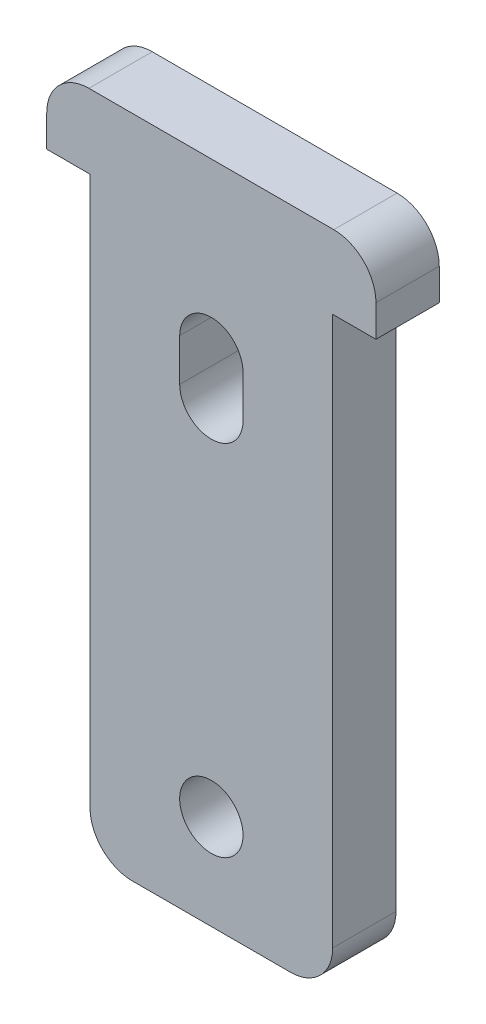
ISO-10303-21;
HEADER;
FILE_DESCRIPTION(('STEP AP214'),'2;1');
FILE_NAME('part.step','',(''),(''),'','','');
FILE_SCHEMA(('AUTOMOTIVE_DESIGN { 1 0 10303 214 1 1 1 1 }'));
ENDSEC;
DATA;
#1=APPLICATION_CONTEXT('core data for automotive mechanical design processes');
#2=APPLICATION_PROTOCOL_DEFINITION('international standard','automotive_design',2000,#1);
#3=PRODUCT_CONTEXT('',#1,'mechanical');
#4=PRODUCT('Part','Part','',(#3));
#5=PRODUCT_RELATED_PRODUCT_CATEGORY('part','',(#4));
#6=PRODUCT_DEFINITION_FORMATION('','',#4);
#7=PRODUCT_DEFINITION_CONTEXT('part definition',#1,'design');
#8=PRODUCT_DEFINITION('design','',#6,#7);
#9=PRODUCT_DEFINITION_SHAPE('','',#8);
#10=(LENGTH_UNIT() NAMED_UNIT(*) SI_UNIT(.MILLI.,.METRE.));
#11=(NAMED_UNIT(*) PLANE_ANGLE_UNIT() SI_UNIT($,.RADIAN.));
#12=(NAMED_UNIT(*) SI_UNIT($,.STERADIAN.) SOLID_ANGLE_UNIT());
#13=UNCERTAINTY_MEASURE_WITH_UNIT(LENGTH_MEASURE(1.E-05),#10,'distance_accuracy_value','');
#14=(GEOMETRIC_REPRESENTATION_CONTEXT(3) GLOBAL_UNCERTAINTY_ASSIGNED_CONTEXT((#13)) GLOBAL_UNIT_ASSIGNED_CONTEXT((#10,
#11,#12)) REPRESENTATION_CONTEXT('',''));
#15=CARTESIAN_POINT('',(0.,0.,0.));
#16=DIRECTION('',(0.,0.,1.));
#17=DIRECTION('',(1.,0.,0.));
#18=AXIS2_PLACEMENT_3D('',#15,#16,#17);
#19=CARTESIAN_POINT('',(0.,0.,3.));
#20=DIRECTION('',(0.,0.,-1.));
#21=DIRECTION('',(-1.,0.,0.));
#22=AXIS2_PLACEMENT_3D('',#19,#20,#21);
#23=PLANE('',#22);
#24=CARTESIAN_POINT('',(5.75,4.5,3.));
#25=DIRECTION('',(0.,0.,1.));
#26=DIRECTION('',(1.,0.,0.));
#27=AXIS2_PLACEMENT_3D('',#24,#25,#26);
#28=CIRCLE('',#27,1.5);
#29=CARTESIAN_POINT('',(7.25,4.5,3.));
#30=VERTEX_POINT('',#29);
#31=EDGE_CURVE('E189',#30,#30,#28,.T.);
#32=ORIENTED_EDGE('',*,*,#31,.F.);
#33=EDGE_LOOP('',(#32));
#34=FACE_BOUND('',#33,.T.);
#35=DIRECTION('',(1.,0.,0.));
#36=VECTOR('',#35,1.);
#37=CARTESIAN_POINT('',(0.,0.,3.));
#38=LINE('',#37,#36);
#39=CARTESIAN_POINT('',(2.,0.,3.));
#40=VERTEX_POINT('',#39);
#41=CARTESIAN_POINT('',(9.5,0.,3.));
#42=VERTEX_POINT('',#41);
#43=EDGE_CURVE('E197',#40,#42,#38,.T.);
#44=ORIENTED_EDGE('',*,*,#43,.T.);
#45=CARTESIAN_POINT('',(9.5,2.,3.));
#46=DIRECTION('',(0.,0.,-1.));
#47=DIRECTION('',(-1.,0.,0.));
#48=AXIS2_PLACEMENT_3D('',#45,#46,#47);
#49=CIRCLE('',#48,2.);
#50=CARTESIAN_POINT('',(11.5,2.,3.));
#51=VERTEX_POINT('',#50);
#52=EDGE_CURVE('E40',#42,#51,#49,.F.);
#53=ORIENTED_EDGE('',*,*,#52,.T.);
#54=DIRECTION('',(0.,1.,0.));
#55=VECTOR('',#54,1.);
#56=CARTESIAN_POINT('',(11.5,0.,3.));
#57=LINE('',#56,#55);
#58=CARTESIAN_POINT('',(11.5,28.,3.));
#59=VERTEX_POINT('',#58);
#60=EDGE_CURVE('E200',#51,#59,#57,.T.);
#61=ORIENTED_EDGE('',*,*,#60,.T.);
#62=DIRECTION('',(1.,0.,0.));
#63=VECTOR('',#62,1.);
#64=CARTESIAN_POINT('',(11.5,28.,3.));
#65=LINE('',#64,#63);
#66=CARTESIAN_POINT('',(13.55,28.,3.));
#67=VERTEX_POINT('',#66);
#68=EDGE_CURVE('E202',#59,#67,#65,.T.);
#69=ORIENTED_EDGE('',*,*,#68,.T.);
#70=DIRECTION('',(0.,1.,0.));
#71=VECTOR('',#70,1.);
#72=CARTESIAN_POINT('',(13.55,28.,3.));
#73=LINE('',#72,#71);
#74=CARTESIAN_POINT('',(13.55,29.5,3.));
#75=VERTEX_POINT('',#74);
#76=EDGE_CURVE('E204',#67,#75,#73,.T.);
#77=ORIENTED_EDGE('',*,*,#76,.T.);
#78=CARTESIAN_POINT('',(11.55,29.5,3.));
#79=DIRECTION('',(0.,0.,-1.));
#80=DIRECTION('',(-1.,0.,0.));
#81=AXIS2_PLACEMENT_3D('',#78,#79,#80);
#82=CIRCLE('',#81,2.);
#83=CARTESIAN_POINT('',(11.55,31.5,3.));
#84=VERTEX_POINT('',#83);
#85=EDGE_CURVE('E254',#75,#84,#82,.F.);
#86=ORIENTED_EDGE('',*,*,#85,.T.);
#87=DIRECTION('',(-1.,0.,0.));
#88=VECTOR('',#87,1.);
#89=CARTESIAN_POINT('',(-2.05,31.5,3.));
#90=LINE('',#89,#88);
#91=CARTESIAN_POINT('',(-0.0499999999999997,31.5,3.));
#92=VERTEX_POINT('',#91);
#93=EDGE_CURVE('E207',#84,#92,#90,.T.);
#94=ORIENTED_EDGE('',*,*,#93,.T.);
#95=CARTESIAN_POINT('',(-0.0499999999999997,29.5,3.));
#96=DIRECTION('',(0.,0.,-1.));
#97=DIRECTION('',(-1.,0.,0.));
#98=AXIS2_PLACEMENT_3D('',#95,#96,#97);
#99=CIRCLE('',#98,2.);
#100=CARTESIAN_POINT('',(-2.05,29.5,3.));
#101=VERTEX_POINT('',#100);
#102=EDGE_CURVE('E256',#92,#101,#99,.F.);
#103=ORIENTED_EDGE('',*,*,#102,.T.);
#104=DIRECTION('',(0.,-1.,0.));
#105=VECTOR('',#104,1.);
#106=CARTESIAN_POINT('',(-2.05,28.,3.));
#107=LINE('',#106,#105);
#108=CARTESIAN_POINT('',(-2.05,28.,3.));
#109=VERTEX_POINT('',#108);
#110=EDGE_CURVE('E210',#101,#109,#107,.T.);
#111=ORIENTED_EDGE('',*,*,#110,.T.);
#112=DIRECTION('',(1.,0.,0.));
#113=VECTOR('',#112,1.);
#114=CARTESIAN_POINT('',(-2.05,28.,3.));
#115=LINE('',#114,#113);
#116=CARTESIAN_POINT('',(0.,28.,3.));
#117=VERTEX_POINT('',#116);
#118=EDGE_CURVE('E212',#109,#117,#115,.T.);
#119=ORIENTED_EDGE('',*,*,#118,.T.);
#120=DIRECTION('',(0.,-1.,0.));
#121=VECTOR('',#120,1.);
#122=CARTESIAN_POINT('',(0.,0.,3.));
#123=LINE('',#122,#121);
#124=CARTESIAN_POINT('',(0.,2.,3.));
#125=VERTEX_POINT('',#124);
#126=EDGE_CURVE('E195',#117,#125,#123,.T.);
#127=ORIENTED_EDGE('',*,*,#126,.T.);
#128=CARTESIAN_POINT('',(2.,2.,3.));
#129=DIRECTION('',(0.,0.,-1.));
#130=DIRECTION('',(-1.,0.,0.));
#131=AXIS2_PLACEMENT_3D('',#128,#129,#130);
#132=CIRCLE('',#131,2.);
#133=EDGE_CURVE('E271',#125,#40,#132,.F.);
#134=ORIENTED_EDGE('',*,*,#133,.T.);
#135=EDGE_LOOP('',(#44,#53,#61,#69,#77,#86,#94,#103,#111,#119,#127,#134));
#136=FACE_BOUND('',#135,.T.);
#137=CARTESIAN_POINT('',(5.75,21.5,3.));
#138=DIRECTION('',(0.,0.,1.));
#139=DIRECTION('',(1.,0.,0.));
#140=AXIS2_PLACEMENT_3D('',#137,#138,#139);
#141=CIRCLE('',#140,1.5);
#142=CARTESIAN_POINT('',(4.25,21.5,3.));
#143=VERTEX_POINT('',#142);
#144=CARTESIAN_POINT('',(7.25,21.5,3.));
#145=VERTEX_POINT('',#144);
#146=EDGE_CURVE('E148',#143,#145,#141,.T.);
#147=ORIENTED_EDGE('',*,*,#146,.F.);
#148=DIRECTION('',(0.,-1.,0.));
#149=VECTOR('',#148,1.);
#150=CARTESIAN_POINT('',(4.25,21.5,3.));
#151=LINE('',#150,#149);
#152=CARTESIAN_POINT('',(4.25,23.5,3.));
#153=VERTEX_POINT('',#152);
#154=EDGE_CURVE('E173',#153,#143,#151,.T.);
#155=ORIENTED_EDGE('',*,*,#154,.F.);
#156=CARTESIAN_POINT('',(5.75,23.5,3.));
#157=DIRECTION('',(0.,0.,1.));
#158=DIRECTION('',(1.,0.,0.));
#159=AXIS2_PLACEMENT_3D('',#156,#157,#158);
#160=CIRCLE('',#159,1.5);
#161=CARTESIAN_POINT('',(7.25,23.5,3.));
#162=VERTEX_POINT('',#161);
#163=EDGE_CURVE('E171',#162,#153,#160,.T.);
#164=ORIENTED_EDGE('',*,*,#163,.F.);
#165=DIRECTION('',(0.,1.,0.));
#166=VECTOR('',#165,1.);
#167=CARTESIAN_POINT('',(7.25,23.5,3.));
#168=LINE('',#167,#166);
#169=EDGE_CURVE('E158',#145,#162,#168,.T.);
#170=ORIENTED_EDGE('',*,*,#169,.F.);
#171=EDGE_LOOP('',(#147,#155,#164,#170));
#172=FACE_BOUND('',#171,.T.);
#173=ADVANCED_FACE('F32',(#34,#136,#172),#23,.F.);
#174=CARTESIAN_POINT('',(0.,0.,0.));
#175=DIRECTION('',(0.,0.,-1.));
#176=DIRECTION('',(-1.,0.,0.));
#177=AXIS2_PLACEMENT_3D('',#174,#175,#176);
#178=PLANE('',#177);
#179=CARTESIAN_POINT('',(5.75,4.5,0.));
#180=DIRECTION('',(0.,0.,1.));
#181=DIRECTION('',(1.,0.,0.));
#182=AXIS2_PLACEMENT_3D('',#179,#180,#181);
#183=CIRCLE('',#182,1.5);
#184=CARTESIAN_POINT('',(7.25,4.5,0.));
#185=VERTEX_POINT('',#184);
#186=EDGE_CURVE('E166',#185,#185,#183,.T.);
#187=ORIENTED_EDGE('',*,*,#186,.T.);
#188=EDGE_LOOP('',(#187));
#189=FACE_BOUND('',#188,.T.);
#190=DIRECTION('',(0.,1.,0.));
#191=VECTOR('',#190,1.);
#192=CARTESIAN_POINT('',(11.5,0.,0.));
#193=LINE('',#192,#191);
#194=CARTESIAN_POINT('',(11.5,2.,0.));
#195=VERTEX_POINT('',#194);
#196=CARTESIAN_POINT('',(11.5,28.,0.));
#197=VERTEX_POINT('',#196);
#198=EDGE_CURVE('E218',#195,#197,#193,.T.);
#199=ORIENTED_EDGE('',*,*,#198,.F.);
#200=CARTESIAN_POINT('',(9.5,2.,0.));
#201=DIRECTION('',(0.,0.,-1.));
#202=DIRECTION('',(-1.,0.,0.));
#203=AXIS2_PLACEMENT_3D('',#200,#201,#202);
#204=CIRCLE('',#203,2.);
#205=CARTESIAN_POINT('',(9.5,0.,0.));
#206=VERTEX_POINT('',#205);
#207=EDGE_CURVE('E265',#195,#206,#204,.T.);
#208=ORIENTED_EDGE('',*,*,#207,.T.);
#209=DIRECTION('',(1.,0.,0.));
#210=VECTOR('',#209,1.);
#211=CARTESIAN_POINT('',(0.,0.,0.));
#212=LINE('',#211,#210);
#213=CARTESIAN_POINT('',(2.,0.,0.));
#214=VERTEX_POINT('',#213);
#215=EDGE_CURVE('E216',#214,#206,#212,.T.);
#216=ORIENTED_EDGE('',*,*,#215,.F.);
#217=CARTESIAN_POINT('',(2.,2.,0.));
#218=DIRECTION('',(0.,0.,-1.));
#219=DIRECTION('',(-1.,0.,0.));
#220=AXIS2_PLACEMENT_3D('',#217,#218,#219);
#221=CIRCLE('',#220,2.);
#222=CARTESIAN_POINT('',(0.,2.,0.));
#223=VERTEX_POINT('',#222);
#224=EDGE_CURVE('E263',#214,#223,#221,.T.);
#225=ORIENTED_EDGE('',*,*,#224,.T.);
#226=DIRECTION('',(0.,-1.,0.));
#227=VECTOR('',#226,1.);
#228=CARTESIAN_POINT('',(0.,0.,0.));
#229=LINE('',#228,#227);
#230=CARTESIAN_POINT('',(0.,28.,0.));
#231=VERTEX_POINT('',#230);
#232=EDGE_CURVE('E192',#231,#223,#229,.T.);
#233=ORIENTED_EDGE('',*,*,#232,.F.);
#234=DIRECTION('',(1.,0.,0.));
#235=VECTOR('',#234,1.);
#236=CARTESIAN_POINT('',(-2.05,28.,0.));
#237=LINE('',#236,#235);
#238=CARTESIAN_POINT('',(-2.05,28.,0.));
#239=VERTEX_POINT('',#238);
#240=EDGE_CURVE('E198',#239,#231,#237,.T.);
#241=ORIENTED_EDGE('',*,*,#240,.F.);
#242=DIRECTION('',(0.,-1.,0.));
#243=VECTOR('',#242,1.);
#244=CARTESIAN_POINT('',(-2.05,28.,0.));
#245=LINE('',#244,#243);
#246=CARTESIAN_POINT('',(-2.05,29.5,0.));
#247=VERTEX_POINT('',#246);
#248=EDGE_CURVE('E228',#247,#239,#245,.T.);
#249=ORIENTED_EDGE('',*,*,#248,.F.);
#250=CARTESIAN_POINT('',(-0.0499999999999997,29.5,0.));
#251=DIRECTION('',(0.,0.,-1.));
#252=DIRECTION('',(-1.,0.,0.));
#253=AXIS2_PLACEMENT_3D('',#250,#251,#252);
#254=CIRCLE('',#253,2.);
#255=CARTESIAN_POINT('',(-0.0499999999999997,31.5,0.));
#256=VERTEX_POINT('',#255);
#257=EDGE_CURVE('E247',#247,#256,#254,.T.);
#258=ORIENTED_EDGE('',*,*,#257,.T.);
#259=DIRECTION('',(-1.,0.,0.));
#260=VECTOR('',#259,1.);
#261=CARTESIAN_POINT('',(-2.05,31.5,0.));
#262=LINE('',#261,#260);
#263=CARTESIAN_POINT('',(11.55,31.5,0.));
#264=VERTEX_POINT('',#263);
#265=EDGE_CURVE('E225',#264,#256,#262,.T.);
#266=ORIENTED_EDGE('',*,*,#265,.F.);
#267=CARTESIAN_POINT('',(11.55,29.5,0.));
#268=DIRECTION('',(0.,0.,-1.));
#269=DIRECTION('',(-1.,0.,0.));
#270=AXIS2_PLACEMENT_3D('',#267,#268,#269);
#271=CIRCLE('',#270,2.);
#272=CARTESIAN_POINT('',(13.55,29.5,0.));
#273=VERTEX_POINT('',#272);
#274=EDGE_CURVE('E245',#264,#273,#271,.T.);
#275=ORIENTED_EDGE('',*,*,#274,.T.);
#276=DIRECTION('',(0.,1.,0.));
#277=VECTOR('',#276,1.);
#278=CARTESIAN_POINT('',(13.55,28.,0.));
#279=LINE('',#278,#277);
#280=CARTESIAN_POINT('',(13.55,28.,0.));
#281=VERTEX_POINT('',#280);
#282=EDGE_CURVE('E222',#281,#273,#279,.T.);
#283=ORIENTED_EDGE('',*,*,#282,.F.);
#284=DIRECTION('',(1.,0.,0.));
#285=VECTOR('',#284,1.);
#286=CARTESIAN_POINT('',(11.5,28.,0.));
#287=LINE('',#286,#285);
#288=EDGE_CURVE('E220',#197,#281,#287,.T.);
#289=ORIENTED_EDGE('',*,*,#288,.F.);
#290=EDGE_LOOP('',(#199,#208,#216,#225,#233,#241,#249,#258,#266,#275,#283,#289));
#291=FACE_BOUND('',#290,.T.);
#292=DIRECTION('',(0.,-1.,0.));
#293=VECTOR('',#292,1.);
#294=CARTESIAN_POINT('',(4.25,21.5,0.));
#295=LINE('',#294,#293);
#296=CARTESIAN_POINT('',(4.25,23.5,0.));
#297=VERTEX_POINT('',#296);
#298=CARTESIAN_POINT('',(4.25,21.5,0.));
#299=VERTEX_POINT('',#298);
#300=EDGE_CURVE('E159',#297,#299,#295,.T.);
#301=ORIENTED_EDGE('',*,*,#300,.T.);
#302=CARTESIAN_POINT('',(5.75,21.5,0.));
#303=DIRECTION('',(0.,0.,1.));
#304=DIRECTION('',(1.,0.,0.));
#305=AXIS2_PLACEMENT_3D('',#302,#303,#304);
#306=CIRCLE('',#305,1.5);
#307=CARTESIAN_POINT('',(7.25,21.5,0.));
#308=VERTEX_POINT('',#307);
#309=EDGE_CURVE('E177',#299,#308,#306,.T.);
#310=ORIENTED_EDGE('',*,*,#309,.T.);
#311=DIRECTION('',(0.,1.,0.));
#312=VECTOR('',#311,1.);
#313=CARTESIAN_POINT('',(7.25,23.5,0.));
#314=LINE('',#313,#312);
#315=CARTESIAN_POINT('',(7.25,23.5,0.));
#316=VERTEX_POINT('',#315);
#317=EDGE_CURVE('E165',#308,#316,#314,.T.);
#318=ORIENTED_EDGE('',*,*,#317,.T.);
#319=CARTESIAN_POINT('',(5.75,23.5,0.));
#320=DIRECTION('',(0.,0.,1.));
#321=DIRECTION('',(1.,0.,0.));
#322=AXIS2_PLACEMENT_3D('',#319,#320,#321);
#323=CIRCLE('',#322,1.5);
#324=EDGE_CURVE('E180',#316,#297,#323,.T.);
#325=ORIENTED_EDGE('',*,*,#324,.T.);
#326=EDGE_LOOP('',(#301,#310,#318,#325));
#327=FACE_BOUND('',#326,.T.);
#328=ADVANCED_FACE('F285',(#189,#291,#327),#178,.T.);
#329=CARTESIAN_POINT('',(0.,0.,3.));
#330=DIRECTION('',(1.,0.,0.));
#331=DIRECTION('',(0.,0.,-1.));
#332=AXIS2_PLACEMENT_3D('',#329,#330,#331);
#333=PLANE('',#332);
#334=ORIENTED_EDGE('',*,*,#232,.T.);
#335=DIRECTION('',(0.,0.,-1.));
#336=VECTOR('',#335,1.);
#337=CARTESIAN_POINT('',(0.,2.,3.));
#338=LINE('',#337,#336);
#339=EDGE_CURVE('E11',#223,#125,#338,.F.);
#340=ORIENTED_EDGE('',*,*,#339,.T.);
#341=ORIENTED_EDGE('',*,*,#126,.F.);
#342=DIRECTION('',(0.,0.,-1.));
#343=VECTOR('',#342,1.);
#344=CARTESIAN_POINT('',(0.,28.,3.));
#345=LINE('',#344,#343);
#346=EDGE_CURVE('E214',#117,#231,#345,.T.);
#347=ORIENTED_EDGE('',*,*,#346,.T.);
#348=EDGE_LOOP('',(#334,#340,#341,#347));
#349=FACE_BOUND('',#348,.T.);
#350=ADVANCED_FACE('F294',(#349),#333,.F.);
#351=CARTESIAN_POINT('',(0.,0.,3.));
#352=DIRECTION('',(0.,1.,0.));
#353=DIRECTION('',(0.,0.,1.));
#354=AXIS2_PLACEMENT_3D('',#351,#352,#353);
#355=PLANE('',#354);
#356=ORIENTED_EDGE('',*,*,#215,.T.);
#357=DIRECTION('',(0.,0.,-1.));
#358=VECTOR('',#357,1.);
#359=CARTESIAN_POINT('',(9.5,0.,3.));
#360=LINE('',#359,#358);
#361=EDGE_CURVE('E53',#206,#42,#360,.F.);
#362=ORIENTED_EDGE('',*,*,#361,.T.);
#363=ORIENTED_EDGE('',*,*,#43,.F.);
#364=DIRECTION('',(0.,0.,-1.));
#365=VECTOR('',#364,1.);
#366=CARTESIAN_POINT('',(2.,0.,3.));
#367=LINE('',#366,#365);
#368=EDGE_CURVE('E267',#40,#214,#367,.T.);
#369=ORIENTED_EDGE('',*,*,#368,.T.);
#370=EDGE_LOOP('',(#356,#362,#363,#369));
#371=FACE_BOUND('',#370,.T.);
#372=ADVANCED_FACE('F288',(#371),#355,.F.);
#373=CARTESIAN_POINT('',(11.5,0.,3.));
#374=DIRECTION('',(-1.,0.,0.));
#375=DIRECTION('',(0.,0.,1.));
#376=AXIS2_PLACEMENT_3D('',#373,#374,#375);
#377=PLANE('',#376);
#378=ORIENTED_EDGE('',*,*,#60,.F.);
#379=DIRECTION('',(0.,0.,-1.));
#380=VECTOR('',#379,1.);
#381=CARTESIAN_POINT('',(11.5,2.,3.));
#382=LINE('',#381,#380);
#383=EDGE_CURVE('E260',#51,#195,#382,.T.);
#384=ORIENTED_EDGE('',*,*,#383,.T.);
#385=ORIENTED_EDGE('',*,*,#198,.T.);
#386=DIRECTION('',(0.,0.,-1.));
#387=VECTOR('',#386,1.);
#388=CARTESIAN_POINT('',(11.5,28.,3.));
#389=LINE('',#388,#387);
#390=EDGE_CURVE('E239',#59,#197,#389,.T.);
#391=ORIENTED_EDGE('',*,*,#390,.F.);
#392=EDGE_LOOP('',(#378,#384,#385,#391));
#393=FACE_BOUND('',#392,.T.);
#394=ADVANCED_FACE('F279',(#393),#377,.F.);
#395=CARTESIAN_POINT('',(11.5,28.,3.));
#396=DIRECTION('',(0.,1.,0.));
#397=DIRECTION('',(0.,0.,1.));
#398=AXIS2_PLACEMENT_3D('',#395,#396,#397);
#399=PLANE('',#398);
#400=ORIENTED_EDGE('',*,*,#288,.T.);
#401=DIRECTION('',(0.,0.,-1.));
#402=VECTOR('',#401,1.);
#403=CARTESIAN_POINT('',(13.55,28.,3.));
#404=LINE('',#403,#402);
#405=EDGE_CURVE('E236',#67,#281,#404,.T.);
#406=ORIENTED_EDGE('',*,*,#405,.F.);
#407=ORIENTED_EDGE('',*,*,#68,.F.);
#408=ORIENTED_EDGE('',*,*,#390,.T.);
#409=EDGE_LOOP('',(#400,#406,#407,#408));
#410=FACE_BOUND('',#409,.T.);
#411=ADVANCED_FACE('F324',(#410),#399,.F.);
#412=CARTESIAN_POINT('',(13.55,28.,3.));
#413=DIRECTION('',(-1.,0.,0.));
#414=DIRECTION('',(0.,0.,1.));
#415=AXIS2_PLACEMENT_3D('',#412,#413,#414);
#416=PLANE('',#415);
#417=ORIENTED_EDGE('',*,*,#282,.T.);
#418=DIRECTION('',(0.,0.,-1.));
#419=VECTOR('',#418,1.);
#420=CARTESIAN_POINT('',(13.55,29.5,3.));
#421=LINE('',#420,#419);
#422=EDGE_CURVE('E258',#273,#75,#421,.F.);
#423=ORIENTED_EDGE('',*,*,#422,.T.);
#424=ORIENTED_EDGE('',*,*,#76,.F.);
#425=ORIENTED_EDGE('',*,*,#405,.T.);
#426=EDGE_LOOP('',(#417,#423,#424,#425));
#427=FACE_BOUND('',#426,.T.);
#428=ADVANCED_FACE('F321',(#427),#416,.F.);
#429=CARTESIAN_POINT('',(-2.05,31.5,3.));
#430=DIRECTION('',(0.,-1.,0.));
#431=DIRECTION('',(0.,0.,-1.));
#432=AXIS2_PLACEMENT_3D('',#429,#430,#431);
#433=PLANE('',#432);
#434=ORIENTED_EDGE('',*,*,#265,.T.);
#435=DIRECTION('',(0.,0.,-1.));
#436=VECTOR('',#435,1.);
#437=CARTESIAN_POINT('',(-0.0499999999999997,31.5,3.));
#438=LINE('',#437,#436);
#439=EDGE_CURVE('E252',#256,#92,#438,.F.);
#440=ORIENTED_EDGE('',*,*,#439,.T.);
#441=ORIENTED_EDGE('',*,*,#93,.F.);
#442=DIRECTION('',(0.,0.,-1.));
#443=VECTOR('',#442,1.);
#444=CARTESIAN_POINT('',(11.55,31.5,3.));
#445=LINE('',#444,#443);
#446=EDGE_CURVE('E249',#84,#264,#445,.T.);
#447=ORIENTED_EDGE('',*,*,#446,.T.);
#448=EDGE_LOOP('',(#434,#440,#441,#447));
#449=FACE_BOUND('',#448,.T.);
#450=ADVANCED_FACE('F312',(#449),#433,.F.);
#451=CARTESIAN_POINT('',(-2.05,28.,3.));
#452=DIRECTION('',(1.,0.,0.));
#453=DIRECTION('',(0.,0.,-1.));
#454=AXIS2_PLACEMENT_3D('',#451,#452,#453);
#455=PLANE('',#454);
#456=ORIENTED_EDGE('',*,*,#110,.F.);
#457=DIRECTION('',(0.,0.,-1.));
#458=VECTOR('',#457,1.);
#459=CARTESIAN_POINT('',(-2.05,29.5,3.));
#460=LINE('',#459,#458);
#461=EDGE_CURVE('E242',#101,#247,#460,.T.);
#462=ORIENTED_EDGE('',*,*,#461,.T.);
#463=ORIENTED_EDGE('',*,*,#248,.T.);
#464=DIRECTION('',(0.,0.,-1.));
#465=VECTOR('',#464,1.);
#466=CARTESIAN_POINT('',(-2.05,28.,3.));
#467=LINE('',#466,#465);
#468=EDGE_CURVE('E233',#109,#239,#467,.T.);
#469=ORIENTED_EDGE('',*,*,#468,.F.);
#470=EDGE_LOOP('',(#456,#462,#463,#469));
#471=FACE_BOUND('',#470,.T.);
#472=ADVANCED_FACE('F304',(#471),#455,.F.);
#473=CARTESIAN_POINT('',(-2.05,28.,3.));
#474=DIRECTION('',(0.,1.,0.));
#475=DIRECTION('',(0.,0.,1.));
#476=AXIS2_PLACEMENT_3D('',#473,#474,#475);
#477=PLANE('',#476);
#478=ORIENTED_EDGE('',*,*,#240,.T.);
#479=ORIENTED_EDGE('',*,*,#346,.F.);
#480=ORIENTED_EDGE('',*,*,#118,.F.);
#481=ORIENTED_EDGE('',*,*,#468,.T.);
#482=EDGE_LOOP('',(#478,#479,#480,#481));
#483=FACE_BOUND('',#482,.T.);
#484=ADVANCED_FACE('F298',(#483),#477,.F.);
#485=CARTESIAN_POINT('',(5.75,4.5,3.));
#486=DIRECTION('',(0.,0.,-1.));
#487=DIRECTION('',(-1.,0.,0.));
#488=AXIS2_PLACEMENT_3D('',#485,#486,#487);
#489=CYLINDRICAL_SURFACE('',#488,1.5);
#490=ORIENTED_EDGE('',*,*,#31,.T.);
#491=EDGE_LOOP('',(#490));
#492=FACE_BOUND('',#491,.T.);
#493=ORIENTED_EDGE('',*,*,#186,.F.);
#494=EDGE_LOOP('',(#493));
#495=FACE_BOUND('',#494,.T.);
#496=ADVANCED_FACE('F343',(#492,#495),#489,.F.);
#497=CARTESIAN_POINT('',(5.75,21.5,3.));
#498=DIRECTION('',(0.,0.,-1.));
#499=DIRECTION('',(-1.,0.,0.));
#500=AXIS2_PLACEMENT_3D('',#497,#498,#499);
#501=CYLINDRICAL_SURFACE('',#500,1.5);
#502=ORIENTED_EDGE('',*,*,#309,.F.);
#503=DIRECTION('',(0.,0.,-1.));
#504=VECTOR('',#503,1.);
#505=CARTESIAN_POINT('',(4.25,21.5,3.));
#506=LINE('',#505,#504);
#507=EDGE_CURVE('E154',#143,#299,#506,.T.);
#508=ORIENTED_EDGE('',*,*,#507,.F.);
#509=ORIENTED_EDGE('',*,*,#146,.T.);
#510=DIRECTION('',(0.,0.,-1.));
#511=VECTOR('',#510,1.);
#512=CARTESIAN_POINT('',(7.25,21.5,3.));
#513=LINE('',#512,#511);
#514=EDGE_CURVE('E151',#145,#308,#513,.T.);
#515=ORIENTED_EDGE('',*,*,#514,.T.);
#516=EDGE_LOOP('',(#502,#508,#509,#515));
#517=FACE_BOUND('',#516,.T.);
#518=ADVANCED_FACE('F150',(#517),#501,.F.);
#519=CARTESIAN_POINT('',(7.25,23.5,3.));
#520=DIRECTION('',(-1.,0.,0.));
#521=DIRECTION('',(0.,0.,1.));
#522=AXIS2_PLACEMENT_3D('',#519,#520,#521);
#523=PLANE('',#522);
#524=ORIENTED_EDGE('',*,*,#317,.F.);
#525=ORIENTED_EDGE('',*,*,#514,.F.);
#526=ORIENTED_EDGE('',*,*,#169,.T.);
#527=DIRECTION('',(0.,0.,-1.));
#528=VECTOR('',#527,1.);
#529=CARTESIAN_POINT('',(7.25,23.5,3.));
#530=LINE('',#529,#528);
#531=EDGE_CURVE('E167',#162,#316,#530,.T.);
#532=ORIENTED_EDGE('',*,*,#531,.T.);
#533=EDGE_LOOP('',(#524,#525,#526,#532));
#534=FACE_BOUND('',#533,.T.);
#535=ADVANCED_FACE('F162',(#534),#523,.T.);
#536=CARTESIAN_POINT('',(5.75,23.5,3.));
#537=DIRECTION('',(0.,0.,-1.));
#538=DIRECTION('',(-1.,0.,0.));
#539=AXIS2_PLACEMENT_3D('',#536,#537,#538);
#540=CYLINDRICAL_SURFACE('',#539,1.5);
#541=ORIENTED_EDGE('',*,*,#324,.F.);
#542=ORIENTED_EDGE('',*,*,#531,.F.);
#543=ORIENTED_EDGE('',*,*,#163,.T.);
#544=DIRECTION('',(0.,0.,-1.));
#545=VECTOR('',#544,1.);
#546=CARTESIAN_POINT('',(4.25,23.5,3.));
#547=LINE('',#546,#545);
#548=EDGE_CURVE('E186',#153,#297,#547,.T.);
#549=ORIENTED_EDGE('',*,*,#548,.T.);
#550=EDGE_LOOP('',(#541,#542,#543,#549));
#551=FACE_BOUND('',#550,.T.);
#552=ADVANCED_FACE('F381',(#551),#540,.F.);
#553=CARTESIAN_POINT('',(4.25,21.5,3.));
#554=DIRECTION('',(1.,0.,0.));
#555=DIRECTION('',(0.,0.,-1.));
#556=AXIS2_PLACEMENT_3D('',#553,#554,#555);
#557=PLANE('',#556);
#558=ORIENTED_EDGE('',*,*,#300,.F.);
#559=ORIENTED_EDGE('',*,*,#548,.F.);
#560=ORIENTED_EDGE('',*,*,#154,.T.);
#561=ORIENTED_EDGE('',*,*,#507,.T.);
#562=EDGE_LOOP('',(#558,#559,#560,#561));
#563=FACE_BOUND('',#562,.T.);
#564=ADVANCED_FACE('F388',(#563),#557,.T.);
#565=CARTESIAN_POINT('',(-0.0499999999999997,29.5,3.));
#566=DIRECTION('',(0.,0.,-1.));
#567=DIRECTION('',(-1.,0.,0.));
#568=AXIS2_PLACEMENT_3D('',#565,#566,#567);
#569=CYLINDRICAL_SURFACE('',#568,2.);
#570=ORIENTED_EDGE('',*,*,#102,.F.);
#571=ORIENTED_EDGE('',*,*,#439,.F.);
#572=ORIENTED_EDGE('',*,*,#257,.F.);
#573=ORIENTED_EDGE('',*,*,#461,.F.);
#574=EDGE_LOOP('',(#570,#571,#572,#573));
#575=FACE_BOUND('',#574,.T.);
#576=ADVANCED_FACE('F308',(#575),#569,.T.);
#577=CARTESIAN_POINT('',(11.55,29.5,3.));
#578=DIRECTION('',(0.,0.,-1.));
#579=DIRECTION('',(-1.,0.,0.));
#580=AXIS2_PLACEMENT_3D('',#577,#578,#579);
#581=CYLINDRICAL_SURFACE('',#580,2.);
#582=ORIENTED_EDGE('',*,*,#85,.F.);
#583=ORIENTED_EDGE('',*,*,#422,.F.);
#584=ORIENTED_EDGE('',*,*,#274,.F.);
#585=ORIENTED_EDGE('',*,*,#446,.F.);
#586=EDGE_LOOP('',(#582,#583,#584,#585));
#587=FACE_BOUND('',#586,.T.);
#588=ADVANCED_FACE('F318',(#587),#581,.T.);
#589=CARTESIAN_POINT('',(9.5,2.,3.));
#590=DIRECTION('',(0.,0.,-1.));
#591=DIRECTION('',(-1.,0.,0.));
#592=AXIS2_PLACEMENT_3D('',#589,#590,#591);
#593=CYLINDRICAL_SURFACE('',#592,2.);
#594=ORIENTED_EDGE('',*,*,#52,.F.);
#595=ORIENTED_EDGE('',*,*,#361,.F.);
#596=ORIENTED_EDGE('',*,*,#207,.F.);
#597=ORIENTED_EDGE('',*,*,#383,.F.);
#598=EDGE_LOOP('',(#594,#595,#596,#597));
#599=FACE_BOUND('',#598,.T.);
#600=ADVANCED_FACE('F282',(#599),#593,.T.);
#601=CARTESIAN_POINT('',(2.,2.,3.));
#602=DIRECTION('',(0.,0.,-1.));
#603=DIRECTION('',(-1.,0.,0.));
#604=AXIS2_PLACEMENT_3D('',#601,#602,#603);
#605=CYLINDRICAL_SURFACE('',#604,2.);
#606=ORIENTED_EDGE('',*,*,#133,.F.);
#607=ORIENTED_EDGE('',*,*,#339,.F.);
#608=ORIENTED_EDGE('',*,*,#224,.F.);
#609=ORIENTED_EDGE('',*,*,#368,.F.);
#610=EDGE_LOOP('',(#606,#607,#608,#609));
#611=FACE_BOUND('',#610,.T.);
#612=ADVANCED_FACE('F34',(#611),#605,.T.);
#613=CLOSED_SHELL('',(#173,#328,#350,#372,#394,#411,#428,#450,#472,#484,#496,#518,#535,#552,
#564,#576,#588,#600,#612));
#614=MANIFOLD_SOLID_BREP('B2',#613);
#615=ADVANCED_BREP_SHAPE_REPRESENTATION('',(#18,#614),#14);
#616=SHAPE_DEFINITION_REPRESENTATION(#9,#615);
ENDSEC;
END-ISO-10303-21;
